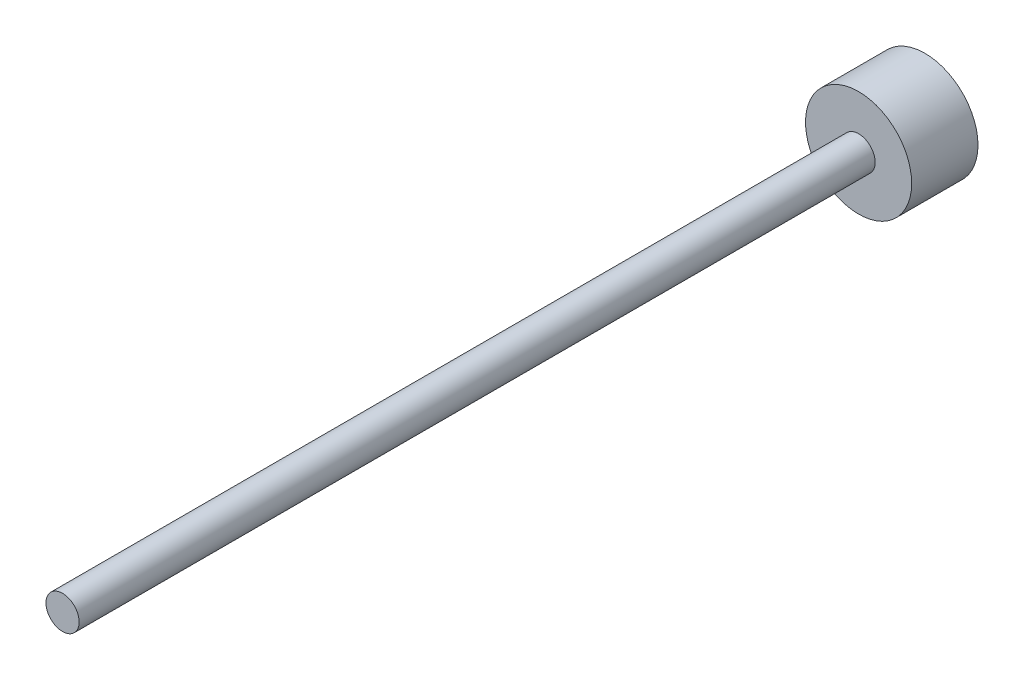
ISO-10303-21;
HEADER;
FILE_DESCRIPTION(('STEP AP214'),'2;1');
FILE_NAME('part.step','',(''),(''),'','','');
FILE_SCHEMA(('AUTOMOTIVE_DESIGN { 1 0 10303 214 1 1 1 1 }'));
ENDSEC;
DATA;
#1=APPLICATION_CONTEXT('core data for automotive mechanical design processes');
#2=APPLICATION_PROTOCOL_DEFINITION('international standard','automotive_design',2000,#1);
#3=PRODUCT_CONTEXT('',#1,'mechanical');
#4=PRODUCT('Part','Part','',(#3));
#5=PRODUCT_RELATED_PRODUCT_CATEGORY('part','',(#4));
#6=PRODUCT_DEFINITION_FORMATION('','',#4);
#7=PRODUCT_DEFINITION_CONTEXT('part definition',#1,'design');
#8=PRODUCT_DEFINITION('design','',#6,#7);
#9=PRODUCT_DEFINITION_SHAPE('','',#8);
#10=(LENGTH_UNIT() NAMED_UNIT(*) SI_UNIT(.MILLI.,.METRE.));
#11=(NAMED_UNIT(*) PLANE_ANGLE_UNIT() SI_UNIT($,.RADIAN.));
#12=(NAMED_UNIT(*) SI_UNIT($,.STERADIAN.) SOLID_ANGLE_UNIT());
#13=UNCERTAINTY_MEASURE_WITH_UNIT(LENGTH_MEASURE(1.E-05),#10,'distance_accuracy_value','');
#14=(GEOMETRIC_REPRESENTATION_CONTEXT(3) GLOBAL_UNCERTAINTY_ASSIGNED_CONTEXT((#13)) GLOBAL_UNIT_ASSIGNED_CONTEXT((#10,
#11,#12)) REPRESENTATION_CONTEXT('',''));
#15=CARTESIAN_POINT('',(0.,0.,0.));
#16=DIRECTION('',(0.,0.,1.));
#17=DIRECTION('',(1.,0.,0.));
#18=AXIS2_PLACEMENT_3D('',#15,#16,#17);
#19=CARTESIAN_POINT('',(0.,0.,10.));
#20=DIRECTION('',(0.,0.,1.));
#21=DIRECTION('',(1.,0.,0.));
#22=AXIS2_PLACEMENT_3D('',#19,#20,#21);
#23=PLANE('',#22);
#24=CARTESIAN_POINT('',(0.,0.,10.));
#25=DIRECTION('',(0.,0.,1.));
#26=DIRECTION('',(1.,0.,0.));
#27=AXIS2_PLACEMENT_3D('',#24,#25,#26);
#28=CIRCLE('',#27,8.);
#29=CARTESIAN_POINT('',(8.,0.,10.));
#30=VERTEX_POINT('',#29);
#31=EDGE_CURVE('E10',#30,#30,#28,.T.);
#32=ORIENTED_EDGE('',*,*,#31,.T.);
#33=EDGE_LOOP('',(#32));
#34=FACE_BOUND('',#33,.T.);
#35=CARTESIAN_POINT('',(0.,0.,10.));
#36=DIRECTION('',(0.,0.,1.));
#37=DIRECTION('',(1.,0.,0.));
#38=AXIS2_PLACEMENT_3D('',#35,#36,#37);
#39=CIRCLE('',#38,2.5);
#40=CARTESIAN_POINT('',(2.5,0.,10.));
#41=VERTEX_POINT('',#40);
#42=EDGE_CURVE('E44',#41,#41,#39,.T.);
#43=ORIENTED_EDGE('',*,*,#42,.F.);
#44=EDGE_LOOP('',(#43));
#45=FACE_BOUND('',#44,.T.);
#46=ADVANCED_FACE('F31',(#34,#45),#23,.T.);
#47=CARTESIAN_POINT('',(0.,0.,10.));
#48=DIRECTION('',(0.,0.,-1.));
#49=DIRECTION('',(-1.,0.,0.));
#50=AXIS2_PLACEMENT_3D('',#47,#48,#49);
#51=CYLINDRICAL_SURFACE('',#50,8.);
#52=ORIENTED_EDGE('',*,*,#31,.F.);
#53=EDGE_LOOP('',(#52));
#54=FACE_BOUND('',#53,.T.);
#55=CARTESIAN_POINT('',(0.,0.,0.));
#56=DIRECTION('',(0.,0.,1.));
#57=DIRECTION('',(1.,0.,0.));
#58=AXIS2_PLACEMENT_3D('',#55,#56,#57);
#59=CIRCLE('',#58,8.);
#60=CARTESIAN_POINT('',(8.,0.,0.));
#61=VERTEX_POINT('',#60);
#62=EDGE_CURVE('E35',#61,#61,#59,.T.);
#63=ORIENTED_EDGE('',*,*,#62,.T.);
#64=EDGE_LOOP('',(#63));
#65=FACE_BOUND('',#64,.T.);
#66=ADVANCED_FACE('F33',(#54,#65),#51,.T.);
#67=CARTESIAN_POINT('',(0.,0.,0.));
#68=DIRECTION('',(0.,0.,1.));
#69=DIRECTION('',(1.,0.,0.));
#70=AXIS2_PLACEMENT_3D('',#67,#68,#69);
#71=PLANE('',#70);
#72=ORIENTED_EDGE('',*,*,#62,.F.);
#73=EDGE_LOOP('',(#72));
#74=FACE_BOUND('',#73,.T.);
#75=ADVANCED_FACE('F55',(#74),#71,.F.);
#76=CARTESIAN_POINT('',(0.,0.,130.));
#77=DIRECTION('',(0.,0.,-1.));
#78=DIRECTION('',(-1.,0.,0.));
#79=AXIS2_PLACEMENT_3D('',#76,#77,#78);
#80=CYLINDRICAL_SURFACE('',#79,2.5);
#81=CARTESIAN_POINT('',(0.,0.,130.));
#82=DIRECTION('',(0.,0.,1.));
#83=DIRECTION('',(1.,0.,0.));
#84=AXIS2_PLACEMENT_3D('',#81,#82,#83);
#85=CIRCLE('',#84,2.5);
#86=CARTESIAN_POINT('',(2.5,0.,130.));
#87=VERTEX_POINT('',#86);
#88=EDGE_CURVE('E42',#87,#87,#85,.T.);
#89=ORIENTED_EDGE('',*,*,#88,.F.);
#90=EDGE_LOOP('',(#89));
#91=FACE_BOUND('',#90,.T.);
#92=ORIENTED_EDGE('',*,*,#42,.T.);
#93=EDGE_LOOP('',(#92));
#94=FACE_BOUND('',#93,.T.);
#95=ADVANCED_FACE('F52',(#91,#94),#80,.T.);
#96=CARTESIAN_POINT('',(0.,0.,130.));
#97=DIRECTION('',(0.,0.,1.));
#98=DIRECTION('',(1.,0.,0.));
#99=AXIS2_PLACEMENT_3D('',#96,#97,#98);
#100=PLANE('',#99);
#101=ORIENTED_EDGE('',*,*,#88,.T.);
#102=EDGE_LOOP('',(#101));
#103=FACE_BOUND('',#102,.T.);
#104=ADVANCED_FACE('F50',(#103),#100,.T.);
#105=CLOSED_SHELL('',(#46,#66,#75,#95,#104));
#106=MANIFOLD_SOLID_BREP('B2',#105);
#107=ADVANCED_BREP_SHAPE_REPRESENTATION('',(#18,#106),#14);
#108=SHAPE_DEFINITION_REPRESENTATION(#9,#107);
ENDSEC;
END-ISO-10303-21;
